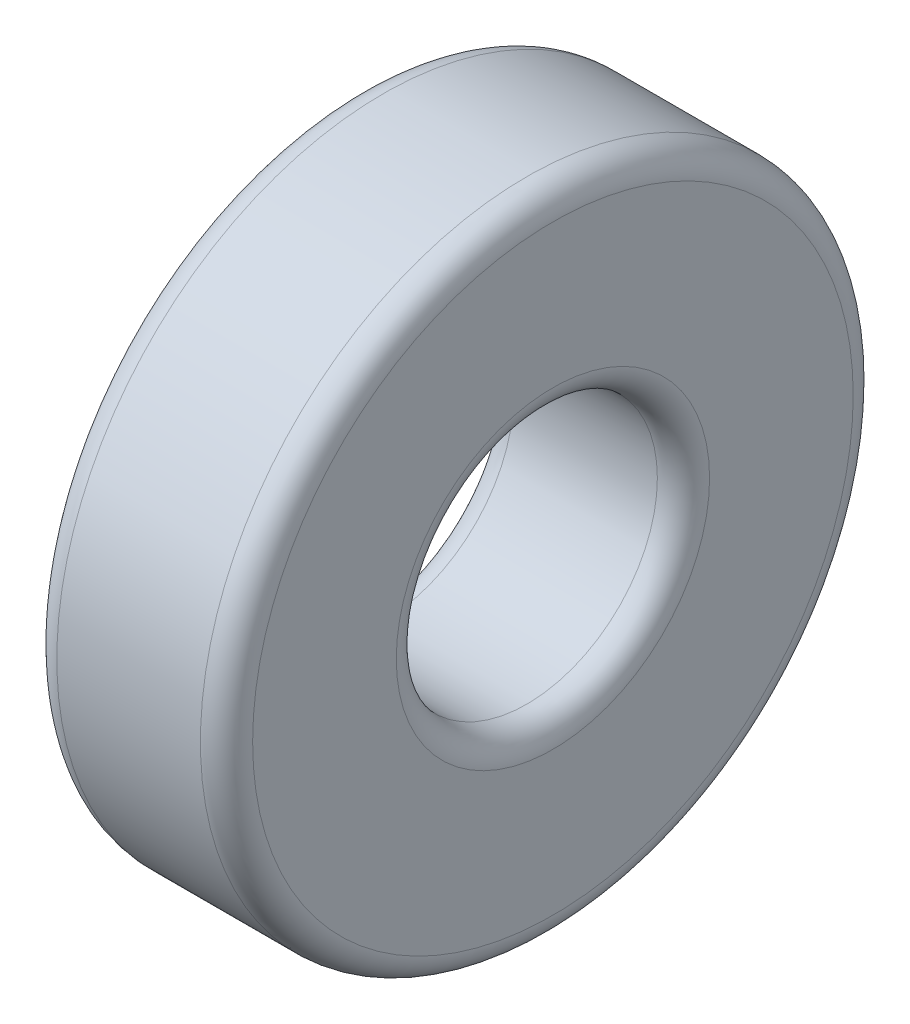
ISO-10303-21;
HEADER;
FILE_DESCRIPTION(('STEP AP214'),'2;1');
FILE_NAME('part.step','',(''),(''),'','','');
FILE_SCHEMA(('AUTOMOTIVE_DESIGN { 1 0 10303 214 1 1 1 1 }'));
ENDSEC;
DATA;
#1=APPLICATION_CONTEXT('core data for automotive mechanical design processes');
#2=APPLICATION_PROTOCOL_DEFINITION('international standard','automotive_design',2000,#1);
#3=PRODUCT_CONTEXT('',#1,'mechanical');
#4=PRODUCT('Part','Part','',(#3));
#5=PRODUCT_RELATED_PRODUCT_CATEGORY('part','',(#4));
#6=PRODUCT_DEFINITION_FORMATION('','',#4);
#7=PRODUCT_DEFINITION_CONTEXT('part definition',#1,'design');
#8=PRODUCT_DEFINITION('design','',#6,#7);
#9=PRODUCT_DEFINITION_SHAPE('','',#8);
#10=(LENGTH_UNIT() NAMED_UNIT(*) SI_UNIT(.MILLI.,.METRE.));
#11=(NAMED_UNIT(*) PLANE_ANGLE_UNIT() SI_UNIT($,.RADIAN.));
#12=(NAMED_UNIT(*) SI_UNIT($,.STERADIAN.) SOLID_ANGLE_UNIT());
#13=UNCERTAINTY_MEASURE_WITH_UNIT(LENGTH_MEASURE(1.E-05),#10,'distance_accuracy_value','');
#14=(GEOMETRIC_REPRESENTATION_CONTEXT(3) GLOBAL_UNCERTAINTY_ASSIGNED_CONTEXT((#13)) GLOBAL_UNIT_ASSIGNED_CONTEXT((#10,
#11,#12)) REPRESENTATION_CONTEXT('',''));
#15=CARTESIAN_POINT('',(0.,0.,0.));
#16=DIRECTION('',(0.,0.,1.));
#17=DIRECTION('',(1.,0.,0.));
#18=AXIS2_PLACEMENT_3D('',#15,#16,#17);
#19=CARTESIAN_POINT('',(-2.75,0.,0.));
#20=DIRECTION('',(1.,0.,0.));
#21=DIRECTION('',(0.,0.,-1.));
#22=AXIS2_PLACEMENT_3D('',#19,#20,#21);
#23=TOROIDAL_SURFACE('',#22,6.,0.999999999999997);
#24=CARTESIAN_POINT('',(-3.75,0.,0.));
#25=DIRECTION('',(1.,0.,0.));
#26=DIRECTION('',(0.,0.,-1.));
#27=AXIS2_PLACEMENT_3D('',#24,#25,#26);
#28=CIRCLE('',#27,6.);
#29=CARTESIAN_POINT('',(-3.75,0.,-6.));
#30=VERTEX_POINT('',#29);
#31=EDGE_CURVE('E10',#30,#30,#28,.T.);
#32=ORIENTED_EDGE('',*,*,#31,.F.);
#33=EDGE_LOOP('',(#32));
#34=FACE_BOUND('',#33,.T.);
#35=CARTESIAN_POINT('',(-2.75,0.,0.));
#36=DIRECTION('',(1.,0.,0.));
#37=DIRECTION('',(0.,0.,-1.));
#38=AXIS2_PLACEMENT_3D('',#35,#36,#37);
#39=CIRCLE('',#38,5.);
#40=CARTESIAN_POINT('',(-2.75,0.,-5.));
#41=VERTEX_POINT('',#40);
#42=EDGE_CURVE('E78',#41,#41,#39,.T.);
#43=ORIENTED_EDGE('',*,*,#42,.T.);
#44=EDGE_LOOP('',(#43));
#45=FACE_BOUND('',#44,.T.);
#46=ADVANCED_FACE('F43',(#34,#45),#23,.T.);
#47=CARTESIAN_POINT('',(-3.75,0.,11.5));
#48=DIRECTION('',(1.,0.,0.));
#49=DIRECTION('',(0.,0.,-1.));
#50=AXIS2_PLACEMENT_3D('',#47,#48,#49);
#51=PLANE('',#50);
#52=CARTESIAN_POINT('',(-3.75,0.,0.));
#53=DIRECTION('',(1.,0.,0.));
#54=DIRECTION('',(0.,0.,-1.));
#55=AXIS2_PLACEMENT_3D('',#52,#53,#54);
#56=CIRCLE('',#55,11.5);
#57=CARTESIAN_POINT('',(-3.75,0.,-11.5));
#58=VERTEX_POINT('',#57);
#59=EDGE_CURVE('E50',#58,#58,#56,.T.);
#60=ORIENTED_EDGE('',*,*,#59,.F.);
#61=EDGE_LOOP('',(#60));
#62=FACE_BOUND('',#61,.T.);
#63=ORIENTED_EDGE('',*,*,#31,.T.);
#64=EDGE_LOOP('',(#63));
#65=FACE_BOUND('',#64,.T.);
#66=ADVANCED_FACE('F116',(#62,#65),#51,.F.);
#67=CARTESIAN_POINT('',(-2.75,0.,0.));
#68=DIRECTION('',(1.,0.,0.));
#69=DIRECTION('',(0.,0.,-1.));
#70=AXIS2_PLACEMENT_3D('',#67,#68,#69);
#71=TOROIDAL_SURFACE('',#70,11.5,1.);
#72=CARTESIAN_POINT('',(-2.75,0.,0.));
#73=DIRECTION('',(1.,0.,0.));
#74=DIRECTION('',(0.,0.,-1.));
#75=AXIS2_PLACEMENT_3D('',#72,#73,#74);
#76=CIRCLE('',#75,12.5);
#77=CARTESIAN_POINT('',(-2.75,0.,-12.5));
#78=VERTEX_POINT('',#77);
#79=EDGE_CURVE('E55',#78,#78,#76,.T.);
#80=ORIENTED_EDGE('',*,*,#79,.F.);
#81=EDGE_LOOP('',(#80));
#82=FACE_BOUND('',#81,.T.);
#83=ORIENTED_EDGE('',*,*,#59,.T.);
#84=EDGE_LOOP('',(#83));
#85=FACE_BOUND('',#84,.T.);
#86=ADVANCED_FACE('F111',(#82,#85),#71,.T.);
#87=CARTESIAN_POINT('',(-3.11111111111111,0.,0.));
#88=DIRECTION('',(1.,0.,0.));
#89=DIRECTION('',(0.,0.,-1.));
#90=AXIS2_PLACEMENT_3D('',#87,#88,#89);
#91=CYLINDRICAL_SURFACE('',#90,12.5);
#92=CARTESIAN_POINT('',(2.75,0.,0.));
#93=DIRECTION('',(1.,0.,0.));
#94=DIRECTION('',(0.,0.,-1.));
#95=AXIS2_PLACEMENT_3D('',#92,#93,#94);
#96=CIRCLE('',#95,12.5);
#97=CARTESIAN_POINT('',(2.75,0.,-12.5));
#98=VERTEX_POINT('',#97);
#99=EDGE_CURVE('E60',#98,#98,#96,.T.);
#100=ORIENTED_EDGE('',*,*,#99,.F.);
#101=EDGE_LOOP('',(#100));
#102=FACE_BOUND('',#101,.T.);
#103=ORIENTED_EDGE('',*,*,#79,.T.);
#104=EDGE_LOOP('',(#103));
#105=FACE_BOUND('',#104,.T.);
#106=ADVANCED_FACE('F105',(#102,#105),#91,.T.);
#107=CARTESIAN_POINT('',(2.75,0.,0.));
#108=DIRECTION('',(1.,0.,0.));
#109=DIRECTION('',(0.,0.,-1.));
#110=AXIS2_PLACEMENT_3D('',#107,#108,#109);
#111=TOROIDAL_SURFACE('',#110,11.5,1.);
#112=CARTESIAN_POINT('',(3.75,0.,0.));
#113=DIRECTION('',(1.,0.,0.));
#114=DIRECTION('',(0.,0.,-1.));
#115=AXIS2_PLACEMENT_3D('',#112,#113,#114);
#116=CIRCLE('',#115,11.5);
#117=CARTESIAN_POINT('',(3.75,0.,-11.5));
#118=VERTEX_POINT('',#117);
#119=EDGE_CURVE('E66',#118,#118,#116,.T.);
#120=ORIENTED_EDGE('',*,*,#119,.F.);
#121=EDGE_LOOP('',(#120));
#122=FACE_BOUND('',#121,.T.);
#123=ORIENTED_EDGE('',*,*,#99,.T.);
#124=EDGE_LOOP('',(#123));
#125=FACE_BOUND('',#124,.T.);
#126=ADVANCED_FACE('F99',(#122,#125),#111,.T.);
#127=CARTESIAN_POINT('',(3.75,0.,11.5));
#128=DIRECTION('',(-1.,0.,0.));
#129=DIRECTION('',(0.,0.,1.));
#130=AXIS2_PLACEMENT_3D('',#127,#128,#129);
#131=PLANE('',#130);
#132=CARTESIAN_POINT('',(3.75,0.,0.));
#133=DIRECTION('',(1.,0.,0.));
#134=DIRECTION('',(0.,0.,-1.));
#135=AXIS2_PLACEMENT_3D('',#132,#133,#134);
#136=CIRCLE('',#135,6.);
#137=CARTESIAN_POINT('',(3.75,0.,-6.));
#138=VERTEX_POINT('',#137);
#139=EDGE_CURVE('E70',#138,#138,#136,.T.);
#140=ORIENTED_EDGE('',*,*,#139,.F.);
#141=EDGE_LOOP('',(#140));
#142=FACE_BOUND('',#141,.T.);
#143=ORIENTED_EDGE('',*,*,#119,.T.);
#144=EDGE_LOOP('',(#143));
#145=FACE_BOUND('',#144,.T.);
#146=ADVANCED_FACE('F93',(#142,#145),#131,.F.);
#147=CARTESIAN_POINT('',(2.75,0.,0.));
#148=DIRECTION('',(1.,0.,0.));
#149=DIRECTION('',(0.,0.,-1.));
#150=AXIS2_PLACEMENT_3D('',#147,#148,#149);
#151=TOROIDAL_SURFACE('',#150,6.,0.999999999999997);
#152=CARTESIAN_POINT('',(2.75,0.,0.));
#153=DIRECTION('',(1.,0.,0.));
#154=DIRECTION('',(0.,0.,-1.));
#155=AXIS2_PLACEMENT_3D('',#152,#153,#154);
#156=CIRCLE('',#155,5.);
#157=CARTESIAN_POINT('',(2.75,0.,-5.));
#158=VERTEX_POINT('',#157);
#159=EDGE_CURVE('E74',#158,#158,#156,.T.);
#160=ORIENTED_EDGE('',*,*,#159,.F.);
#161=EDGE_LOOP('',(#160));
#162=FACE_BOUND('',#161,.T.);
#163=ORIENTED_EDGE('',*,*,#139,.T.);
#164=EDGE_LOOP('',(#163));
#165=FACE_BOUND('',#164,.T.);
#166=ADVANCED_FACE('F87',(#162,#165),#151,.T.);
#167=CARTESIAN_POINT('',(-3.11111111111111,0.,0.));
#168=DIRECTION('',(1.,0.,0.));
#169=DIRECTION('',(0.,0.,-1.));
#170=AXIS2_PLACEMENT_3D('',#167,#168,#169);
#171=CYLINDRICAL_SURFACE('',#170,5.);
#172=ORIENTED_EDGE('',*,*,#42,.F.);
#173=EDGE_LOOP('',(#172));
#174=FACE_BOUND('',#173,.T.);
#175=ORIENTED_EDGE('',*,*,#159,.T.);
#176=EDGE_LOOP('',(#175));
#177=FACE_BOUND('',#176,.T.);
#178=ADVANCED_FACE('F84',(#174,#177),#171,.F.);
#179=CLOSED_SHELL('',(#46,#66,#86,#106,#126,#146,#166,#178));
#180=MANIFOLD_SOLID_BREP('B2',#179);
#181=ADVANCED_BREP_SHAPE_REPRESENTATION('',(#18,#180),#14);
#182=SHAPE_DEFINITION_REPRESENTATION(#9,#181);
ENDSEC;
END-ISO-10303-21;
